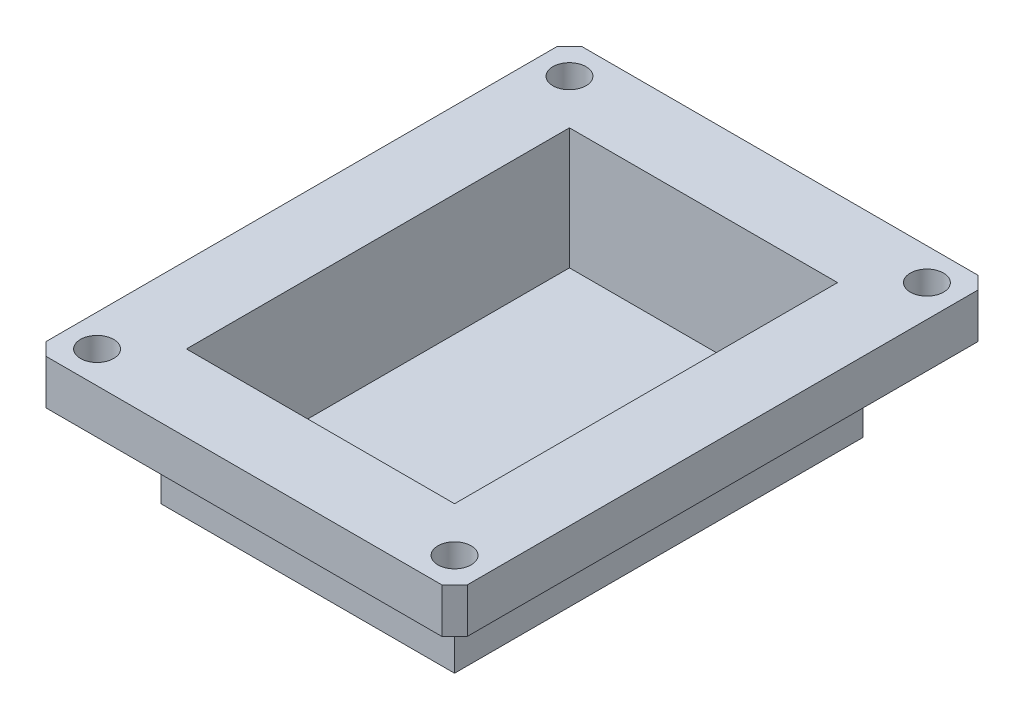
ISO-10303-21;
HEADER;
FILE_DESCRIPTION(('STEP AP214'),'2;1');
FILE_NAME('part.step','',(''),(''),'','','');
FILE_SCHEMA(('AUTOMOTIVE_DESIGN { 1 0 10303 214 1 1 1 1 }'));
ENDSEC;
DATA;
#1=APPLICATION_CONTEXT('core data for automotive mechanical design processes');
#2=APPLICATION_PROTOCOL_DEFINITION('international standard','automotive_design',2000,#1);
#3=PRODUCT_CONTEXT('',#1,'mechanical');
#4=PRODUCT('Part','Part','',(#3));
#5=PRODUCT_RELATED_PRODUCT_CATEGORY('part','',(#4));
#6=PRODUCT_DEFINITION_FORMATION('','',#4);
#7=PRODUCT_DEFINITION_CONTEXT('part definition',#1,'design');
#8=PRODUCT_DEFINITION('design','',#6,#7);
#9=PRODUCT_DEFINITION_SHAPE('','',#8);
#10=(LENGTH_UNIT() NAMED_UNIT(*) SI_UNIT(.MILLI.,.METRE.));
#11=(NAMED_UNIT(*) PLANE_ANGLE_UNIT() SI_UNIT($,.RADIAN.));
#12=(NAMED_UNIT(*) SI_UNIT($,.STERADIAN.) SOLID_ANGLE_UNIT());
#13=UNCERTAINTY_MEASURE_WITH_UNIT(LENGTH_MEASURE(1.E-05),#10,'distance_accuracy_value','');
#14=(GEOMETRIC_REPRESENTATION_CONTEXT(3) GLOBAL_UNCERTAINTY_ASSIGNED_CONTEXT((#13)) GLOBAL_UNIT_ASSIGNED_CONTEXT((#10,
#11,#12)) REPRESENTATION_CONTEXT('',''));
#15=CARTESIAN_POINT('',(0.,0.,0.));
#16=DIRECTION('',(0.,0.,1.));
#17=DIRECTION('',(1.,0.,0.));
#18=AXIS2_PLACEMENT_3D('',#15,#16,#17);
#19=CARTESIAN_POINT('',(57.5,35.,0.));
#20=DIRECTION('',(1.,0.,0.));
#21=DIRECTION('',(0.,0.,-1.));
#22=AXIS2_PLACEMENT_3D('',#19,#20,#21);
#23=PLANE('',#22);
#24=DIRECTION('',(0.,-1.,0.));
#25=VECTOR('',#24,1.);
#26=CARTESIAN_POINT('',(57.5,35.,-40.1578354002259));
#27=LINE('',#26,#25);
#28=CARTESIAN_POINT('',(57.5,30.,-40.1578354002259));
#29=VERTEX_POINT('',#28);
#30=CARTESIAN_POINT('',(57.5,0.,-40.1578354002259));
#31=VERTEX_POINT('',#30);
#32=EDGE_CURVE('E252',#29,#31,#27,.T.);
#33=ORIENTED_EDGE('',*,*,#32,.F.);
#34=DIRECTION('',(0.,0.,1.));
#35=VECTOR('',#34,1.);
#36=CARTESIAN_POINT('',(57.5,30.,0.));
#37=LINE('',#36,#35);
#38=CARTESIAN_POINT('',(57.5,30.,119.842164599775));
#39=VERTEX_POINT('',#38);
#40=EDGE_CURVE('E266',#29,#39,#37,.T.);
#41=ORIENTED_EDGE('',*,*,#40,.T.);
#42=DIRECTION('',(0.,-1.,0.));
#43=VECTOR('',#42,1.);
#44=CARTESIAN_POINT('',(57.5,35.,119.842164599775));
#45=LINE('',#44,#43);
#46=CARTESIAN_POINT('',(57.5,0.,119.842164599775));
#47=VERTEX_POINT('',#46);
#48=EDGE_CURVE('E246',#39,#47,#45,.T.);
#49=ORIENTED_EDGE('',*,*,#48,.T.);
#50=DIRECTION('',(0.,0.,1.));
#51=VECTOR('',#50,1.);
#52=CARTESIAN_POINT('',(57.5,0.,0.));
#53=LINE('',#52,#51);
#54=EDGE_CURVE('E225',#31,#47,#53,.T.);
#55=ORIENTED_EDGE('',*,*,#54,.F.);
#56=EDGE_LOOP('',(#33,#41,#49,#55));
#57=FACE_BOUND('',#56,.T.);
#58=ADVANCED_FACE('F41',(#57),#23,.T.);
#59=CARTESIAN_POINT('',(-1.67190575551642E-13,35.,-40.1578354002257));
#60=DIRECTION('',(0.,0.,1.));
#61=DIRECTION('',(1.,0.,0.));
#62=AXIS2_PLACEMENT_3D('',#59,#60,#61);
#63=PLANE('',#62);
#64=DIRECTION('',(0.,-1.,0.));
#65=VECTOR('',#64,1.);
#66=CARTESIAN_POINT('',(-57.5,35.,-40.1578354002255));
#67=LINE('',#66,#65);
#68=CARTESIAN_POINT('',(-57.5,30.,-40.1578354002255));
#69=VERTEX_POINT('',#68);
#70=CARTESIAN_POINT('',(-57.5,0.,-40.1578354002255));
#71=VERTEX_POINT('',#70);
#72=EDGE_CURVE('E250',#69,#71,#67,.T.);
#73=ORIENTED_EDGE('',*,*,#72,.F.);
#74=DIRECTION('',(1.,0.,0.));
#75=VECTOR('',#74,1.);
#76=CARTESIAN_POINT('',(57.5,30.,-40.1578354002259));
#77=LINE('',#76,#75);
#78=EDGE_CURVE('E268',#69,#29,#77,.T.);
#79=ORIENTED_EDGE('',*,*,#78,.T.);
#80=ORIENTED_EDGE('',*,*,#32,.T.);
#81=DIRECTION('',(-1.,0.,0.));
#82=VECTOR('',#81,1.);
#83=CARTESIAN_POINT('',(-1.67190575551642E-13,0.,-40.1578354002257));
#84=LINE('',#83,#82);
#85=EDGE_CURVE('E237',#31,#71,#84,.T.);
#86=ORIENTED_EDGE('',*,*,#85,.T.);
#87=EDGE_LOOP('',(#73,#79,#80,#86));
#88=FACE_BOUND('',#87,.T.);
#89=ADVANCED_FACE('F356',(#88),#63,.F.);
#90=CARTESIAN_POINT('',(-57.4999999999998,35.,2.14455189717632E-13));
#91=DIRECTION('',(1.,0.,0.));
#92=DIRECTION('',(0.,0.,-1.));
#93=AXIS2_PLACEMENT_3D('',#90,#91,#92);
#94=PLANE('',#93);
#95=DIRECTION('',(0.,-1.,0.));
#96=VECTOR('',#95,1.);
#97=CARTESIAN_POINT('',(-57.4999999999994,35.,119.842164599775));
#98=LINE('',#97,#96);
#99=CARTESIAN_POINT('',(-57.4999999999994,30.,119.842164599775));
#100=VERTEX_POINT('',#99);
#101=CARTESIAN_POINT('',(-57.4999999999994,0.,119.842164599775));
#102=VERTEX_POINT('',#101);
#103=EDGE_CURVE('E248',#100,#102,#98,.T.);
#104=ORIENTED_EDGE('',*,*,#103,.F.);
#105=DIRECTION('',(0.,0.,-1.));
#106=VECTOR('',#105,1.);
#107=CARTESIAN_POINT('',(-57.5,30.,-40.1578354002255));
#108=LINE('',#107,#106);
#109=EDGE_CURVE('E270',#100,#69,#108,.T.);
#110=ORIENTED_EDGE('',*,*,#109,.T.);
#111=ORIENTED_EDGE('',*,*,#72,.T.);
#112=DIRECTION('',(0.,0.,1.));
#113=VECTOR('',#112,1.);
#114=CARTESIAN_POINT('',(-57.4999999999998,0.,2.14455189717632E-13));
#115=LINE('',#114,#113);
#116=EDGE_CURVE('E240',#71,#102,#115,.T.);
#117=ORIENTED_EDGE('',*,*,#116,.T.);
#118=EDGE_LOOP('',(#104,#110,#111,#117));
#119=FACE_BOUND('',#118,.T.);
#120=ADVANCED_FACE('F362',(#119),#94,.F.);
#121=CARTESIAN_POINT('',(0.,35.,119.842164599775));
#122=DIRECTION('',(0.,0.,-1.));
#123=DIRECTION('',(-1.,0.,0.));
#124=AXIS2_PLACEMENT_3D('',#121,#122,#123);
#125=PLANE('',#124);
#126=ORIENTED_EDGE('',*,*,#48,.F.);
#127=DIRECTION('',(-1.,0.,0.));
#128=VECTOR('',#127,1.);
#129=CARTESIAN_POINT('',(-57.4999999999994,30.,119.842164599775));
#130=LINE('',#129,#128);
#131=EDGE_CURVE('E263',#39,#100,#130,.T.);
#132=ORIENTED_EDGE('',*,*,#131,.T.);
#133=ORIENTED_EDGE('',*,*,#103,.T.);
#134=DIRECTION('',(1.,0.,0.));
#135=VECTOR('',#134,1.);
#136=CARTESIAN_POINT('',(0.,0.,119.842164599775));
#137=LINE('',#136,#135);
#138=EDGE_CURVE('E243',#102,#47,#137,.T.);
#139=ORIENTED_EDGE('',*,*,#138,.T.);
#140=EDGE_LOOP('',(#126,#132,#133,#139));
#141=FACE_BOUND('',#140,.T.);
#142=ADVANCED_FACE('F422',(#141),#125,.F.);
#143=CARTESIAN_POINT('',(0.,0.,0.));
#144=DIRECTION('',(0.,1.,0.));
#145=DIRECTION('',(0.,0.,1.));
#146=AXIS2_PLACEMENT_3D('',#143,#144,#145);
#147=PLANE('',#146);
#148=ORIENTED_EDGE('',*,*,#54,.T.);
#149=ORIENTED_EDGE('',*,*,#138,.F.);
#150=ORIENTED_EDGE('',*,*,#116,.F.);
#151=ORIENTED_EDGE('',*,*,#85,.F.);
#152=EDGE_LOOP('',(#148,#149,#150,#151));
#153=FACE_BOUND('',#152,.T.);
#154=ADVANCED_FACE('F434',(#153),#147,.F.);
#155=CARTESIAN_POINT('',(82.5,52.5,0.));
#156=DIRECTION('',(1.,0.,0.));
#157=DIRECTION('',(0.,0.,-1.));
#158=AXIS2_PLACEMENT_3D('',#155,#156,#157);
#159=PLANE('',#158);
#160=DIRECTION('',(0.,0.,1.));
#161=VECTOR('',#160,1.);
#162=CARTESIAN_POINT('',(82.5,52.5,0.));
#163=LINE('',#162,#161);
#164=CARTESIAN_POINT('',(82.5,52.5,-60.1578354002249));
#165=VERTEX_POINT('',#164);
#166=CARTESIAN_POINT('',(82.5,52.5,139.842164599775));
#167=VERTEX_POINT('',#166);
#168=EDGE_CURVE('E214',#165,#167,#163,.T.);
#169=ORIENTED_EDGE('',*,*,#168,.T.);
#170=DIRECTION('',(0.,-1.,0.));
#171=VECTOR('',#170,1.);
#172=CARTESIAN_POINT('',(82.5,35.,139.842164599775));
#173=LINE('',#172,#171);
#174=CARTESIAN_POINT('',(82.5,35.,139.842164599775));
#175=VERTEX_POINT('',#174);
#176=EDGE_CURVE('E285',#167,#175,#173,.T.);
#177=ORIENTED_EDGE('',*,*,#176,.T.);
#178=DIRECTION('',(0.,0.,1.));
#179=VECTOR('',#178,1.);
#180=CARTESIAN_POINT('',(82.5,35.,0.));
#181=LINE('',#180,#179);
#182=CARTESIAN_POINT('',(82.5,35.,-60.1578354002249));
#183=VERTEX_POINT('',#182);
#184=EDGE_CURVE('E210',#183,#175,#181,.T.);
#185=ORIENTED_EDGE('',*,*,#184,.F.);
#186=DIRECTION('',(0.,1.,0.));
#187=VECTOR('',#186,1.);
#188=CARTESIAN_POINT('',(82.5,52.5,-60.1578354002249));
#189=LINE('',#188,#187);
#190=EDGE_CURVE('E272',#183,#165,#189,.T.);
#191=ORIENTED_EDGE('',*,*,#190,.T.);
#192=EDGE_LOOP('',(#169,#177,#185,#191));
#193=FACE_BOUND('',#192,.T.);
#194=ADVANCED_FACE('F342',(#193),#159,.T.);
#195=CARTESIAN_POINT('',(1.80849322740166E-13,52.5,-65.1578354002254));
#196=DIRECTION('',(0.,0.,1.));
#197=DIRECTION('',(1.,0.,0.));
#198=AXIS2_PLACEMENT_3D('',#195,#196,#197);
#199=PLANE('',#198);
#200=DIRECTION('',(-1.,0.,0.));
#201=VECTOR('',#200,1.);
#202=CARTESIAN_POINT('',(1.80849322740166E-13,52.5,-65.1578354002254));
#203=LINE('',#202,#201);
#204=CARTESIAN_POINT('',(77.4999999999998,52.5,-65.1578354002251));
#205=VERTEX_POINT('',#204);
#206=CARTESIAN_POINT('',(-77.5,52.5,-65.1578354002256));
#207=VERTEX_POINT('',#206);
#208=EDGE_CURVE('E217',#205,#207,#203,.T.);
#209=ORIENTED_EDGE('',*,*,#208,.F.);
#210=DIRECTION('',(0.,-1.,0.));
#211=VECTOR('',#210,1.);
#212=CARTESIAN_POINT('',(77.4999999999998,35.,-65.1578354002251));
#213=LINE('',#212,#211);
#214=CARTESIAN_POINT('',(77.4999999999998,35.,-65.1578354002251));
#215=VERTEX_POINT('',#214);
#216=EDGE_CURVE('E310',#205,#215,#213,.T.);
#217=ORIENTED_EDGE('',*,*,#216,.T.);
#218=DIRECTION('',(-1.,0.,0.));
#219=VECTOR('',#218,1.);
#220=CARTESIAN_POINT('',(1.80849322740166E-13,35.,-65.1578354002254));
#221=LINE('',#220,#219);
#222=CARTESIAN_POINT('',(-77.5,35.,-65.1578354002256));
#223=VERTEX_POINT('',#222);
#224=EDGE_CURVE('E228',#215,#223,#221,.T.);
#225=ORIENTED_EDGE('',*,*,#224,.T.);
#226=DIRECTION('',(0.,1.,0.));
#227=VECTOR('',#226,1.);
#228=CARTESIAN_POINT('',(-77.5,52.5,-65.1578354002256));
#229=LINE('',#228,#227);
#230=EDGE_CURVE('E308',#223,#207,#229,.T.);
#231=ORIENTED_EDGE('',*,*,#230,.T.);
#232=EDGE_LOOP('',(#209,#217,#225,#231));
#233=FACE_BOUND('',#232,.T.);
#234=ADVANCED_FACE('F316',(#233),#199,.F.);
#235=CARTESIAN_POINT('',(-82.5000000000001,52.5,0.));
#236=DIRECTION('',(1.,0.,0.));
#237=DIRECTION('',(0.,0.,-1.));
#238=AXIS2_PLACEMENT_3D('',#235,#236,#237);
#239=PLANE('',#238);
#240=DIRECTION('',(0.,0.,1.));
#241=VECTOR('',#240,1.);
#242=CARTESIAN_POINT('',(-82.5000000000001,52.5,0.));
#243=LINE('',#242,#241);
#244=CARTESIAN_POINT('',(-82.5000000000001,52.5,-60.1578354002256));
#245=VERTEX_POINT('',#244);
#246=CARTESIAN_POINT('',(-82.5000000000001,52.5,139.842164599775));
#247=VERTEX_POINT('',#246);
#248=EDGE_CURVE('E220',#245,#247,#243,.T.);
#249=ORIENTED_EDGE('',*,*,#248,.F.);
#250=DIRECTION('',(0.,-1.,0.));
#251=VECTOR('',#250,1.);
#252=CARTESIAN_POINT('',(-82.5000000000001,52.5,-60.1578354002256));
#253=LINE('',#252,#251);
#254=CARTESIAN_POINT('',(-82.5000000000001,35.,-60.1578354002256));
#255=VERTEX_POINT('',#254);
#256=EDGE_CURVE('E11',#245,#255,#253,.T.);
#257=ORIENTED_EDGE('',*,*,#256,.T.);
#258=DIRECTION('',(0.,0.,1.));
#259=VECTOR('',#258,1.);
#260=CARTESIAN_POINT('',(-82.5000000000001,35.,0.));
#261=LINE('',#260,#259);
#262=CARTESIAN_POINT('',(-82.5000000000001,35.,139.842164599775));
#263=VERTEX_POINT('',#262);
#264=EDGE_CURVE('E231',#255,#263,#261,.T.);
#265=ORIENTED_EDGE('',*,*,#264,.T.);
#266=DIRECTION('',(0.,1.,0.));
#267=VECTOR('',#266,1.);
#268=CARTESIAN_POINT('',(-82.5000000000001,52.5,139.842164599775));
#269=LINE('',#268,#267);
#270=EDGE_CURVE('E50',#263,#247,#269,.T.);
#271=ORIENTED_EDGE('',*,*,#270,.T.);
#272=EDGE_LOOP('',(#249,#257,#265,#271));
#273=FACE_BOUND('',#272,.T.);
#274=ADVANCED_FACE('F327',(#273),#239,.F.);
#275=CARTESIAN_POINT('',(5.11658973875689E-13,52.5,144.842164599775));
#276=DIRECTION('',(0.,0.,-1.));
#277=DIRECTION('',(-1.,0.,0.));
#278=AXIS2_PLACEMENT_3D('',#275,#276,#277);
#279=PLANE('',#278);
#280=DIRECTION('',(1.,0.,0.));
#281=VECTOR('',#280,1.);
#282=CARTESIAN_POINT('',(5.11658973875689E-13,35.,144.842164599775));
#283=LINE('',#282,#281);
#284=CARTESIAN_POINT('',(-77.5000000000001,35.,144.842164599775));
#285=VERTEX_POINT('',#284);
#286=CARTESIAN_POINT('',(77.5,35.,144.842164599775));
#287=VERTEX_POINT('',#286);
#288=EDGE_CURVE('E218',#285,#287,#283,.T.);
#289=ORIENTED_EDGE('',*,*,#288,.T.);
#290=DIRECTION('',(0.,1.,0.));
#291=VECTOR('',#290,1.);
#292=CARTESIAN_POINT('',(77.5,52.5,144.842164599775));
#293=LINE('',#292,#291);
#294=CARTESIAN_POINT('',(77.5,52.5,144.842164599775));
#295=VERTEX_POINT('',#294);
#296=EDGE_CURVE('E299',#287,#295,#293,.T.);
#297=ORIENTED_EDGE('',*,*,#296,.T.);
#298=DIRECTION('',(1.,0.,0.));
#299=VECTOR('',#298,1.);
#300=CARTESIAN_POINT('',(5.11658973875689E-13,52.5,144.842164599775));
#301=LINE('',#300,#299);
#302=CARTESIAN_POINT('',(-77.5000000000001,52.5,144.842164599775));
#303=VERTEX_POINT('',#302);
#304=EDGE_CURVE('E222',#303,#295,#301,.T.);
#305=ORIENTED_EDGE('',*,*,#304,.F.);
#306=DIRECTION('',(0.,-1.,0.));
#307=VECTOR('',#306,1.);
#308=CARTESIAN_POINT('',(-77.5000000000001,52.5,144.842164599775));
#309=LINE('',#308,#307);
#310=EDGE_CURVE('E296',#303,#285,#309,.T.);
#311=ORIENTED_EDGE('',*,*,#310,.T.);
#312=EDGE_LOOP('',(#289,#297,#305,#311));
#313=FACE_BOUND('',#312,.T.);
#314=ADVANCED_FACE('F335',(#313),#279,.F.);
#315=CARTESIAN_POINT('',(0.,52.5,0.));
#316=DIRECTION('',(0.,1.,0.));
#317=DIRECTION('',(0.,0.,1.));
#318=AXIS2_PLACEMENT_3D('',#315,#316,#317);
#319=PLANE('',#318);
#320=CARTESIAN_POINT('',(70.0000000000003,52.5,-52.6578354002254));
#321=DIRECTION('',(0.,1.,0.));
#322=DIRECTION('',(0.,0.,-1.));
#323=AXIS2_PLACEMENT_3D('',#320,#321,#322);
#324=CIRCLE('',#323,6.5);
#325=CARTESIAN_POINT('',(70.0000000000003,52.5,-59.1578354002254));
#326=VERTEX_POINT('',#325);
#327=EDGE_CURVE('E283',#326,#326,#324,.T.);
#328=ORIENTED_EDGE('',*,*,#327,.F.);
#329=EDGE_LOOP('',(#328));
#330=FACE_BOUND('',#329,.T.);
#331=CARTESIAN_POINT('',(69.9999999999983,52.5,132.342164599775));
#332=DIRECTION('',(0.,1.,0.));
#333=DIRECTION('',(0.,0.,1.));
#334=AXIS2_PLACEMENT_3D('',#331,#332,#333);
#335=CIRCLE('',#334,6.49999999999999);
#336=CARTESIAN_POINT('',(69.9999999999983,52.5,138.842164599775));
#337=VERTEX_POINT('',#336);
#338=EDGE_CURVE('E662',#337,#337,#335,.T.);
#339=ORIENTED_EDGE('',*,*,#338,.F.);
#340=EDGE_LOOP('',(#339));
#341=FACE_BOUND('',#340,.T.);
#342=CARTESIAN_POINT('',(-69.9999999999984,52.5,132.342164599775));
#343=DIRECTION('',(0.,1.,0.));
#344=DIRECTION('',(0.,0.,-1.));
#345=AXIS2_PLACEMENT_3D('',#342,#343,#344);
#346=CIRCLE('',#345,6.5);
#347=CARTESIAN_POINT('',(-69.9999999999984,52.5,125.842164599775));
#348=VERTEX_POINT('',#347);
#349=EDGE_CURVE('E667',#348,#348,#346,.T.);
#350=ORIENTED_EDGE('',*,*,#349,.F.);
#351=EDGE_LOOP('',(#350));
#352=FACE_BOUND('',#351,.T.);
#353=CARTESIAN_POINT('',(-70.,52.5,-52.6578354002255));
#354=DIRECTION('',(0.,1.,0.));
#355=DIRECTION('',(0.,0.,1.));
#356=AXIS2_PLACEMENT_3D('',#353,#354,#355);
#357=CIRCLE('',#356,6.5);
#358=CARTESIAN_POINT('',(-70.,52.5,-46.1578354002255));
#359=VERTEX_POINT('',#358);
#360=EDGE_CURVE('E679',#359,#359,#357,.T.);
#361=ORIENTED_EDGE('',*,*,#360,.F.);
#362=EDGE_LOOP('',(#361));
#363=FACE_BOUND('',#362,.T.);
#364=DIRECTION('',(0.,0.,1.));
#365=VECTOR('',#364,1.);
#366=CARTESIAN_POINT('',(-52.5,52.5,-35.1578354002255));
#367=LINE('',#366,#365);
#368=CARTESIAN_POINT('',(-52.5,52.5,-35.1578354002255));
#369=VERTEX_POINT('',#368);
#370=CARTESIAN_POINT('',(-52.5,52.5,114.842164599775));
#371=VERTEX_POINT('',#370);
#372=EDGE_CURVE('E175',#369,#371,#367,.T.);
#373=ORIENTED_EDGE('',*,*,#372,.F.);
#374=DIRECTION('',(-1.,0.,0.));
#375=VECTOR('',#374,1.);
#376=CARTESIAN_POINT('',(-52.5,52.5,-35.1578354002255));
#377=LINE('',#376,#375);
#378=CARTESIAN_POINT('',(52.5,52.5,-35.1578354002255));
#379=VERTEX_POINT('',#378);
#380=EDGE_CURVE('E192',#379,#369,#377,.T.);
#381=ORIENTED_EDGE('',*,*,#380,.F.);
#382=DIRECTION('',(0.,0.,-1.));
#383=VECTOR('',#382,1.);
#384=CARTESIAN_POINT('',(52.5,52.5,-35.1578354002255));
#385=LINE('',#384,#383);
#386=CARTESIAN_POINT('',(52.5,52.5,114.842164599775));
#387=VERTEX_POINT('',#386);
#388=EDGE_CURVE('E195',#387,#379,#385,.T.);
#389=ORIENTED_EDGE('',*,*,#388,.F.);
#390=DIRECTION('',(1.,0.,0.));
#391=VECTOR('',#390,1.);
#392=CARTESIAN_POINT('',(-52.5,52.5,114.842164599775));
#393=LINE('',#392,#391);
#394=EDGE_CURVE('E204',#371,#387,#393,.T.);
#395=ORIENTED_EDGE('',*,*,#394,.F.);
#396=EDGE_LOOP('',(#373,#381,#389,#395));
#397=FACE_BOUND('',#396,.T.);
#398=ORIENTED_EDGE('',*,*,#304,.T.);
#399=DIRECTION('',(0.707106781186549,0.,-0.707106781186546));
#400=VECTOR('',#399,1.);
#401=CARTESIAN_POINT('',(111.171082299887,52.5,111.171082299888));
#402=LINE('',#401,#400);
#403=EDGE_CURVE('E306',#295,#167,#402,.T.);
#404=ORIENTED_EDGE('',*,*,#403,.T.);
#405=ORIENTED_EDGE('',*,*,#168,.F.);
#406=DIRECTION('',(-0.707106781186547,0.,-0.707106781186548));
#407=VECTOR('',#406,1.);
#408=CARTESIAN_POINT('',(71.3289177001125,52.5,-71.3289177001124));
#409=LINE('',#408,#407);
#410=EDGE_CURVE('E304',#165,#205,#409,.T.);
#411=ORIENTED_EDGE('',*,*,#410,.T.);
#412=ORIENTED_EDGE('',*,*,#208,.T.);
#413=DIRECTION('',(0.707106781186551,0.,-0.707106781186544));
#414=VECTOR('',#413,1.);
#415=CARTESIAN_POINT('',(-71.3289177001124,52.5,-71.3289177001131));
#416=LINE('',#415,#414);
#417=EDGE_CURVE('E63',#207,#245,#416,.F.);
#418=ORIENTED_EDGE('',*,*,#417,.T.);
#419=ORIENTED_EDGE('',*,*,#248,.T.);
#420=DIRECTION('',(-0.707106781186546,0.,-0.707106781186549));
#421=VECTOR('',#420,1.);
#422=CARTESIAN_POINT('',(-111.171082299888,52.5,111.171082299887));
#423=LINE('',#422,#421);
#424=EDGE_CURVE('E301',#247,#303,#423,.F.);
#425=ORIENTED_EDGE('',*,*,#424,.T.);
#426=EDGE_LOOP('',(#398,#404,#405,#411,#412,#418,#419,#425));
#427=FACE_BOUND('',#426,.T.);
#428=ADVANCED_FACE('F329',(#330,#341,#352,#363,#397,#427),#319,.T.);
#429=CARTESIAN_POINT('',(0.,35.,0.));
#430=DIRECTION('',(0.,1.,0.));
#431=DIRECTION('',(0.,0.,1.));
#432=AXIS2_PLACEMENT_3D('',#429,#430,#431);
#433=PLANE('',#432);
#434=DIRECTION('',(0.,0.,1.));
#435=VECTOR('',#434,1.);
#436=CARTESIAN_POINT('',(-62.4999999999995,35.,119.842164599775));
#437=LINE('',#436,#435);
#438=CARTESIAN_POINT('',(-62.5000000000001,35.,-45.1578354002255));
#439=VERTEX_POINT('',#438);
#440=CARTESIAN_POINT('',(-62.4999999999994,35.,124.842164599775));
#441=VERTEX_POINT('',#440);
#442=EDGE_CURVE('E254',#439,#441,#437,.T.);
#443=ORIENTED_EDGE('',*,*,#442,.T.);
#444=DIRECTION('',(1.,0.,0.));
#445=VECTOR('',#444,1.);
#446=CARTESIAN_POINT('',(57.5,35.,124.842164599775));
#447=LINE('',#446,#445);
#448=CARTESIAN_POINT('',(62.5000000000001,35.,124.842164599775));
#449=VERTEX_POINT('',#448);
#450=EDGE_CURVE('E260',#441,#449,#447,.T.);
#451=ORIENTED_EDGE('',*,*,#450,.T.);
#452=DIRECTION('',(0.,0.,-1.));
#453=VECTOR('',#452,1.);
#454=CARTESIAN_POINT('',(62.5000000000001,35.,0.));
#455=LINE('',#454,#453);
#456=CARTESIAN_POINT('',(62.5000000000001,35.,-45.157835400226));
#457=VERTEX_POINT('',#456);
#458=EDGE_CURVE('E258',#449,#457,#455,.T.);
#459=ORIENTED_EDGE('',*,*,#458,.T.);
#460=DIRECTION('',(-1.,0.,0.));
#461=VECTOR('',#460,1.);
#462=CARTESIAN_POINT('',(-57.5,35.,-45.1578354002255));
#463=LINE('',#462,#461);
#464=EDGE_CURVE('E256',#457,#439,#463,.T.);
#465=ORIENTED_EDGE('',*,*,#464,.T.);
#466=EDGE_LOOP('',(#443,#451,#459,#465));
#467=FACE_BOUND('',#466,.T.);
#468=CARTESIAN_POINT('',(70.0000000000003,35.,-52.6578354002254));
#469=DIRECTION('',(0.,1.,0.));
#470=DIRECTION('',(0.,0.,1.));
#471=AXIS2_PLACEMENT_3D('',#468,#469,#470);
#472=CIRCLE('',#471,6.5);
#473=CARTESIAN_POINT('',(70.0000000000003,35.,-46.1578354002254));
#474=VERTEX_POINT('',#473);
#475=EDGE_CURVE('E672',#474,#474,#472,.F.);
#476=ORIENTED_EDGE('',*,*,#475,.F.);
#477=EDGE_LOOP('',(#476));
#478=FACE_BOUND('',#477,.T.);
#479=CARTESIAN_POINT('',(69.9999999999983,35.,132.342164599775));
#480=DIRECTION('',(0.,1.,0.));
#481=DIRECTION('',(0.,0.,1.));
#482=AXIS2_PLACEMENT_3D('',#479,#480,#481);
#483=CIRCLE('',#482,6.49999999999999);
#484=CARTESIAN_POINT('',(69.9999999999983,35.,138.842164599775));
#485=VERTEX_POINT('',#484);
#486=EDGE_CURVE('E665',#485,#485,#483,.F.);
#487=ORIENTED_EDGE('',*,*,#486,.F.);
#488=EDGE_LOOP('',(#487));
#489=FACE_BOUND('',#488,.T.);
#490=CARTESIAN_POINT('',(-69.9999999999984,35.,132.342164599775));
#491=DIRECTION('',(0.,1.,0.));
#492=DIRECTION('',(0.,0.,1.));
#493=AXIS2_PLACEMENT_3D('',#490,#491,#492);
#494=CIRCLE('',#493,6.5);
#495=CARTESIAN_POINT('',(-69.9999999999984,35.,138.842164599775));
#496=VERTEX_POINT('',#495);
#497=EDGE_CURVE('E670',#496,#496,#494,.F.);
#498=ORIENTED_EDGE('',*,*,#497,.F.);
#499=EDGE_LOOP('',(#498));
#500=FACE_BOUND('',#499,.T.);
#501=CARTESIAN_POINT('',(-70.,35.,-52.6578354002255));
#502=DIRECTION('',(0.,1.,0.));
#503=DIRECTION('',(0.,0.,1.));
#504=AXIS2_PLACEMENT_3D('',#501,#502,#503);
#505=CIRCLE('',#504,6.5);
#506=CARTESIAN_POINT('',(-70.,35.,-46.1578354002255));
#507=VERTEX_POINT('',#506);
#508=EDGE_CURVE('E198',#507,#507,#505,.F.);
#509=ORIENTED_EDGE('',*,*,#508,.F.);
#510=EDGE_LOOP('',(#509));
#511=FACE_BOUND('',#510,.T.);
#512=ORIENTED_EDGE('',*,*,#184,.T.);
#513=DIRECTION('',(-0.707106781186549,0.,0.707106781186546));
#514=VECTOR('',#513,1.);
#515=CARTESIAN_POINT('',(82.5,35.,139.842164599775));
#516=LINE('',#515,#514);
#517=EDGE_CURVE('E294',#175,#287,#516,.T.);
#518=ORIENTED_EDGE('',*,*,#517,.T.);
#519=ORIENTED_EDGE('',*,*,#288,.F.);
#520=DIRECTION('',(0.707106781186546,0.,0.707106781186549));
#521=VECTOR('',#520,1.);
#522=CARTESIAN_POINT('',(-77.5000000000001,35.,144.842164599775));
#523=LINE('',#522,#521);
#524=EDGE_CURVE('E288',#285,#263,#523,.F.);
#525=ORIENTED_EDGE('',*,*,#524,.T.);
#526=ORIENTED_EDGE('',*,*,#264,.F.);
#527=DIRECTION('',(-0.707106781186551,0.,0.707106781186544));
#528=VECTOR('',#527,1.);
#529=CARTESIAN_POINT('',(-82.5000000000001,35.,-60.1578354002256));
#530=LINE('',#529,#528);
#531=EDGE_CURVE('E290',#255,#223,#530,.F.);
#532=ORIENTED_EDGE('',*,*,#531,.T.);
#533=ORIENTED_EDGE('',*,*,#224,.F.);
#534=DIRECTION('',(0.707106781186547,0.,0.707106781186548));
#535=VECTOR('',#534,1.);
#536=CARTESIAN_POINT('',(77.4999999999998,35.,-65.1578354002251));
#537=LINE('',#536,#535);
#538=EDGE_CURVE('E292',#215,#183,#537,.T.);
#539=ORIENTED_EDGE('',*,*,#538,.T.);
#540=EDGE_LOOP('',(#512,#518,#519,#525,#526,#532,#533,#539));
#541=FACE_BOUND('',#540,.T.);
#542=ADVANCED_FACE('F321',(#467,#478,#489,#500,#511,#541),#433,.F.);
#543=CARTESIAN_POINT('',(-52.5,5.,-35.1578354002255));
#544=DIRECTION('',(-1.,0.,0.));
#545=DIRECTION('',(0.,0.,1.));
#546=AXIS2_PLACEMENT_3D('',#543,#544,#545);
#547=PLANE('',#546);
#548=ORIENTED_EDGE('',*,*,#372,.T.);
#549=DIRECTION('',(0.,1.,0.));
#550=VECTOR('',#549,1.);
#551=CARTESIAN_POINT('',(-52.5,5.,114.842164599775));
#552=LINE('',#551,#550);
#553=CARTESIAN_POINT('',(-52.5,5.,114.842164599775));
#554=VERTEX_POINT('',#553);
#555=EDGE_CURVE('E168',#554,#371,#552,.T.);
#556=ORIENTED_EDGE('',*,*,#555,.F.);
#557=DIRECTION('',(0.,0.,1.));
#558=VECTOR('',#557,1.);
#559=CARTESIAN_POINT('',(-52.5,5.,-35.1578354002255));
#560=LINE('',#559,#558);
#561=CARTESIAN_POINT('',(-52.5,5.,-35.1578354002255));
#562=VERTEX_POINT('',#561);
#563=EDGE_CURVE('E172',#562,#554,#560,.T.);
#564=ORIENTED_EDGE('',*,*,#563,.F.);
#565=DIRECTION('',(0.,1.,0.));
#566=VECTOR('',#565,1.);
#567=CARTESIAN_POINT('',(-52.5,5.,-35.1578354002255));
#568=LINE('',#567,#566);
#569=EDGE_CURVE('E208',#562,#369,#568,.T.);
#570=ORIENTED_EDGE('',*,*,#569,.T.);
#571=EDGE_LOOP('',(#548,#556,#564,#570));
#572=FACE_BOUND('',#571,.T.);
#573=ADVANCED_FACE('F170',(#572),#547,.F.);
#574=CARTESIAN_POINT('',(-52.5,5.,-35.1578354002255));
#575=DIRECTION('',(0.,0.,-1.));
#576=DIRECTION('',(-1.,0.,0.));
#577=AXIS2_PLACEMENT_3D('',#574,#575,#576);
#578=PLANE('',#577);
#579=ORIENTED_EDGE('',*,*,#380,.T.);
#580=ORIENTED_EDGE('',*,*,#569,.F.);
#581=DIRECTION('',(-1.,0.,0.));
#582=VECTOR('',#581,1.);
#583=CARTESIAN_POINT('',(-52.5,5.,-35.1578354002255));
#584=LINE('',#583,#582);
#585=CARTESIAN_POINT('',(52.5,5.,-35.1578354002255));
#586=VERTEX_POINT('',#585);
#587=EDGE_CURVE('E180',#586,#562,#584,.T.);
#588=ORIENTED_EDGE('',*,*,#587,.F.);
#589=DIRECTION('',(0.,1.,0.));
#590=VECTOR('',#589,1.);
#591=CARTESIAN_POINT('',(52.5,5.,-35.1578354002255));
#592=LINE('',#591,#590);
#593=EDGE_CURVE('E211',#586,#379,#592,.T.);
#594=ORIENTED_EDGE('',*,*,#593,.T.);
#595=EDGE_LOOP('',(#579,#580,#588,#594));
#596=FACE_BOUND('',#595,.T.);
#597=ADVANCED_FACE('F565',(#596),#578,.F.);
#598=CARTESIAN_POINT('',(52.5,5.,-35.1578354002255));
#599=DIRECTION('',(1.,0.,0.));
#600=DIRECTION('',(0.,0.,-1.));
#601=AXIS2_PLACEMENT_3D('',#598,#599,#600);
#602=PLANE('',#601);
#603=ORIENTED_EDGE('',*,*,#388,.T.);
#604=ORIENTED_EDGE('',*,*,#593,.F.);
#605=DIRECTION('',(0.,0.,-1.));
#606=VECTOR('',#605,1.);
#607=CARTESIAN_POINT('',(52.5,5.,-35.1578354002255));
#608=LINE('',#607,#606);
#609=CARTESIAN_POINT('',(52.5,5.,114.842164599775));
#610=VERTEX_POINT('',#609);
#611=EDGE_CURVE('E188',#610,#586,#608,.T.);
#612=ORIENTED_EDGE('',*,*,#611,.F.);
#613=DIRECTION('',(0.,1.,0.));
#614=VECTOR('',#613,1.);
#615=CARTESIAN_POINT('',(52.5,5.,114.842164599775));
#616=LINE('',#615,#614);
#617=EDGE_CURVE('E179',#610,#387,#616,.T.);
#618=ORIENTED_EDGE('',*,*,#617,.T.);
#619=EDGE_LOOP('',(#603,#604,#612,#618));
#620=FACE_BOUND('',#619,.T.);
#621=ADVANCED_FACE('F571',(#620),#602,.F.);
#622=CARTESIAN_POINT('',(-52.5,5.,114.842164599775));
#623=DIRECTION('',(0.,0.,1.));
#624=DIRECTION('',(1.,0.,0.));
#625=AXIS2_PLACEMENT_3D('',#622,#623,#624);
#626=PLANE('',#625);
#627=ORIENTED_EDGE('',*,*,#394,.T.);
#628=ORIENTED_EDGE('',*,*,#617,.F.);
#629=DIRECTION('',(1.,0.,0.));
#630=VECTOR('',#629,1.);
#631=CARTESIAN_POINT('',(-52.5,5.,114.842164599775));
#632=LINE('',#631,#630);
#633=EDGE_CURVE('E183',#554,#610,#632,.T.);
#634=ORIENTED_EDGE('',*,*,#633,.F.);
#635=ORIENTED_EDGE('',*,*,#555,.T.);
#636=EDGE_LOOP('',(#627,#628,#634,#635));
#637=FACE_BOUND('',#636,.T.);
#638=ADVANCED_FACE('F184',(#637),#626,.F.);
#639=CARTESIAN_POINT('',(0.,5.,0.));
#640=DIRECTION('',(0.,1.,0.));
#641=DIRECTION('',(0.,0.,1.));
#642=AXIS2_PLACEMENT_3D('',#639,#640,#641);
#643=PLANE('',#642);
#644=ORIENTED_EDGE('',*,*,#563,.T.);
#645=ORIENTED_EDGE('',*,*,#633,.T.);
#646=ORIENTED_EDGE('',*,*,#611,.T.);
#647=ORIENTED_EDGE('',*,*,#587,.T.);
#648=EDGE_LOOP('',(#644,#645,#646,#647));
#649=FACE_BOUND('',#648,.T.);
#650=ADVANCED_FACE('F190',(#649),#643,.T.);
#651=CARTESIAN_POINT('',(-70.,-0.001000000000001,-52.6578354002255));
#652=DIRECTION('',(0.,1.,0.));
#653=DIRECTION('',(0.,0.,1.));
#654=AXIS2_PLACEMENT_3D('',#651,#652,#653);
#655=CYLINDRICAL_SURFACE('',#654,6.5);
#656=ORIENTED_EDGE('',*,*,#360,.T.);
#657=EDGE_LOOP('',(#656));
#658=FACE_BOUND('',#657,.T.);
#659=ORIENTED_EDGE('',*,*,#508,.T.);
#660=EDGE_LOOP('',(#659));
#661=FACE_BOUND('',#660,.T.);
#662=ADVANCED_FACE('F592',(#658,#661),#655,.F.);
#663=CARTESIAN_POINT('',(-69.9999999999984,-0.001000000000001,132.342164599775));
#664=DIRECTION('',(0.,1.,0.));
#665=DIRECTION('',(0.,0.,1.));
#666=AXIS2_PLACEMENT_3D('',#663,#664,#665);
#667=CYLINDRICAL_SURFACE('',#666,6.5);
#668=ORIENTED_EDGE('',*,*,#349,.T.);
#669=EDGE_LOOP('',(#668));
#670=FACE_BOUND('',#669,.T.);
#671=ORIENTED_EDGE('',*,*,#497,.T.);
#672=EDGE_LOOP('',(#671));
#673=FACE_BOUND('',#672,.T.);
#674=ADVANCED_FACE('F599',(#670,#673),#667,.F.);
#675=CARTESIAN_POINT('',(69.9999999999983,-0.001000000000001,132.342164599775));
#676=DIRECTION('',(0.,1.,0.));
#677=DIRECTION('',(0.,0.,1.));
#678=AXIS2_PLACEMENT_3D('',#675,#676,#677);
#679=CYLINDRICAL_SURFACE('',#678,6.49999999999999);
#680=ORIENTED_EDGE('',*,*,#338,.T.);
#681=EDGE_LOOP('',(#680));
#682=FACE_BOUND('',#681,.T.);
#683=ORIENTED_EDGE('',*,*,#486,.T.);
#684=EDGE_LOOP('',(#683));
#685=FACE_BOUND('',#684,.T.);
#686=ADVANCED_FACE('F408',(#682,#685),#679,.F.);
#687=CARTESIAN_POINT('',(70.0000000000003,-0.001000000000001,-52.6578354002254));
#688=DIRECTION('',(0.,1.,0.));
#689=DIRECTION('',(0.,0.,1.));
#690=AXIS2_PLACEMENT_3D('',#687,#688,#689);
#691=CYLINDRICAL_SURFACE('',#690,6.5);
#692=ORIENTED_EDGE('',*,*,#327,.T.);
#693=EDGE_LOOP('',(#692));
#694=FACE_BOUND('',#693,.T.);
#695=ORIENTED_EDGE('',*,*,#475,.T.);
#696=EDGE_LOOP('',(#695));
#697=FACE_BOUND('',#696,.T.);
#698=ADVANCED_FACE('F394',(#694,#697),#691,.F.);
#699=CARTESIAN_POINT('',(-1.88007257263364E-13,35.,-45.1578354002258));
#700=DIRECTION('',(0.,-0.707106781186551,-0.707106781186543));
#701=DIRECTION('',(1.,0.,0.));
#702=AXIS2_PLACEMENT_3D('',#699,#700,#701);
#703=PLANE('',#702);
#704=DIRECTION('',(0.577350269189627,0.577350269189621,-0.57735026918963));
#705=VECTOR('',#704,1.);
#706=CARTESIAN_POINT('',(41.6666666666665,14.1666666666666,-24.3245020668923));
#707=LINE('',#706,#705);
#708=EDGE_CURVE('E277',#29,#457,#707,.T.);
#709=ORIENTED_EDGE('',*,*,#708,.F.);
#710=ORIENTED_EDGE('',*,*,#78,.F.);
#711=DIRECTION('',(0.57735026918963,-0.577350269189622,0.577350269189626));
#712=VECTOR('',#711,1.);
#713=CARTESIAN_POINT('',(-47.4473881999247,19.9473881999248,-30.1052236001502));
#714=LINE('',#713,#712);
#715=EDGE_CURVE('E280',#439,#69,#714,.T.);
#716=ORIENTED_EDGE('',*,*,#715,.F.);
#717=ORIENTED_EDGE('',*,*,#464,.F.);
#718=EDGE_LOOP('',(#709,#710,#716,#717));
#719=FACE_BOUND('',#718,.T.);
#720=ADVANCED_FACE('F389',(#719),#703,.T.);
#721=CARTESIAN_POINT('',(-62.4999999999999,35.,2.33103467084383E-13));
#722=DIRECTION('',(-0.707106781186543,-0.707106781186551,0.));
#723=DIRECTION('',(0.,0.,-1.));
#724=AXIS2_PLACEMENT_3D('',#721,#722,#723);
#725=PLANE('',#724);
#726=ORIENTED_EDGE('',*,*,#715,.T.);
#727=ORIENTED_EDGE('',*,*,#109,.F.);
#728=DIRECTION('',(-0.577350269189627,0.577350269189622,0.577350269189629));
#729=VECTOR('',#728,1.);
#730=CARTESIAN_POINT('',(-20.8859451334079,-6.61405486659124,83.2281097331829));
#731=LINE('',#730,#729);
#732=EDGE_CURVE('E275',#441,#100,#731,.F.);
#733=ORIENTED_EDGE('',*,*,#732,.F.);
#734=ORIENTED_EDGE('',*,*,#442,.F.);
#735=EDGE_LOOP('',(#726,#727,#733,#734));
#736=FACE_BOUND('',#735,.T.);
#737=ADVANCED_FACE('F382',(#736),#725,.T.);
#738=CARTESIAN_POINT('',(57.5,30.,0.));
#739=DIRECTION('',(-0.707106781186543,0.707106781186551,0.));
#740=DIRECTION('',(0.,0.,1.));
#741=AXIS2_PLACEMENT_3D('',#738,#739,#740);
#742=PLANE('',#741);
#743=ORIENTED_EDGE('',*,*,#708,.T.);
#744=ORIENTED_EDGE('',*,*,#458,.F.);
#745=DIRECTION('',(0.577350269189628,0.577350269189622,0.577350269189628));
#746=VECTOR('',#745,1.);
#747=CARTESIAN_POINT('',(17.5526118000749,-9.94738819992469,79.8947763998494));
#748=LINE('',#747,#746);
#749=EDGE_CURVE('E273',#39,#449,#748,.T.);
#750=ORIENTED_EDGE('',*,*,#749,.F.);
#751=ORIENTED_EDGE('',*,*,#40,.F.);
#752=EDGE_LOOP('',(#743,#744,#750,#751));
#753=FACE_BOUND('',#752,.T.);
#754=ADVANCED_FACE('F375',(#753),#742,.F.);
#755=CARTESIAN_POINT('',(0.,35.,124.842164599775));
#756=DIRECTION('',(0.,-0.707106781186551,0.707106781186543));
#757=DIRECTION('',(-1.,0.,0.));
#758=AXIS2_PLACEMENT_3D('',#755,#756,#757);
#759=PLANE('',#758);
#760=ORIENTED_EDGE('',*,*,#732,.T.);
#761=ORIENTED_EDGE('',*,*,#131,.F.);
#762=ORIENTED_EDGE('',*,*,#749,.T.);
#763=ORIENTED_EDGE('',*,*,#450,.F.);
#764=EDGE_LOOP('',(#760,#761,#762,#763));
#765=FACE_BOUND('',#764,.T.);
#766=ADVANCED_FACE('F352',(#765),#759,.T.);
#767=CARTESIAN_POINT('',(82.5,52.5,139.842164599775));
#768=DIRECTION('',(0.707106781186546,0.,0.707106781186549));
#769=DIRECTION('',(0.,1.,0.));
#770=AXIS2_PLACEMENT_3D('',#767,#768,#769);
#771=PLANE('',#770);
#772=ORIENTED_EDGE('',*,*,#403,.F.);
#773=ORIENTED_EDGE('',*,*,#296,.F.);
#774=ORIENTED_EDGE('',*,*,#517,.F.);
#775=ORIENTED_EDGE('',*,*,#176,.F.);
#776=EDGE_LOOP('',(#772,#773,#774,#775));
#777=FACE_BOUND('',#776,.T.);
#778=ADVANCED_FACE('F340',(#777),#771,.T.);
#779=CARTESIAN_POINT('',(77.4999999999998,52.5,-65.1578354002251));
#780=DIRECTION('',(0.707106781186548,0.,-0.707106781186547));
#781=DIRECTION('',(0.,1.,0.));
#782=AXIS2_PLACEMENT_3D('',#779,#780,#781);
#783=PLANE('',#782);
#784=ORIENTED_EDGE('',*,*,#410,.F.);
#785=ORIENTED_EDGE('',*,*,#190,.F.);
#786=ORIENTED_EDGE('',*,*,#538,.F.);
#787=ORIENTED_EDGE('',*,*,#216,.F.);
#788=EDGE_LOOP('',(#784,#785,#786,#787));
#789=FACE_BOUND('',#788,.T.);
#790=ADVANCED_FACE('F345',(#789),#783,.T.);
#791=CARTESIAN_POINT('',(-82.5000000000001,52.5,-60.1578354002256));
#792=DIRECTION('',(0.707106781186544,0.,0.707106781186551));
#793=DIRECTION('',(0.,-1.,0.));
#794=AXIS2_PLACEMENT_3D('',#791,#792,#793);
#795=PLANE('',#794);
#796=ORIENTED_EDGE('',*,*,#417,.F.);
#797=ORIENTED_EDGE('',*,*,#230,.F.);
#798=ORIENTED_EDGE('',*,*,#531,.F.);
#799=ORIENTED_EDGE('',*,*,#256,.F.);
#800=EDGE_LOOP('',(#796,#797,#798,#799));
#801=FACE_BOUND('',#800,.T.);
#802=ADVANCED_FACE('F326',(#801),#795,.F.);
#803=CARTESIAN_POINT('',(-77.5000000000001,52.5,144.842164599775));
#804=DIRECTION('',(0.707106781186549,0.,-0.707106781186546));
#805=DIRECTION('',(0.,-1.,0.));
#806=AXIS2_PLACEMENT_3D('',#803,#804,#805);
#807=PLANE('',#806);
#808=ORIENTED_EDGE('',*,*,#424,.F.);
#809=ORIENTED_EDGE('',*,*,#270,.F.);
#810=ORIENTED_EDGE('',*,*,#524,.F.);
#811=ORIENTED_EDGE('',*,*,#310,.F.);
#812=EDGE_LOOP('',(#808,#809,#810,#811));
#813=FACE_BOUND('',#812,.T.);
#814=ADVANCED_FACE('F44',(#813),#807,.F.);
#815=CLOSED_SHELL('',(#58,#89,#120,#142,#154,#194,#234,#274,#314,#428,#542,#573,#597,#621,#638,
#650,#662,#674,#686,#698,#720,#737,#754,#766,#778,#790,#802,#814));
#816=MANIFOLD_SOLID_BREP('B2',#815);
#817=ADVANCED_BREP_SHAPE_REPRESENTATION('',(#18,#816),#14);
#818=SHAPE_DEFINITION_REPRESENTATION(#9,#817);
ENDSEC;
END-ISO-10303-21;
